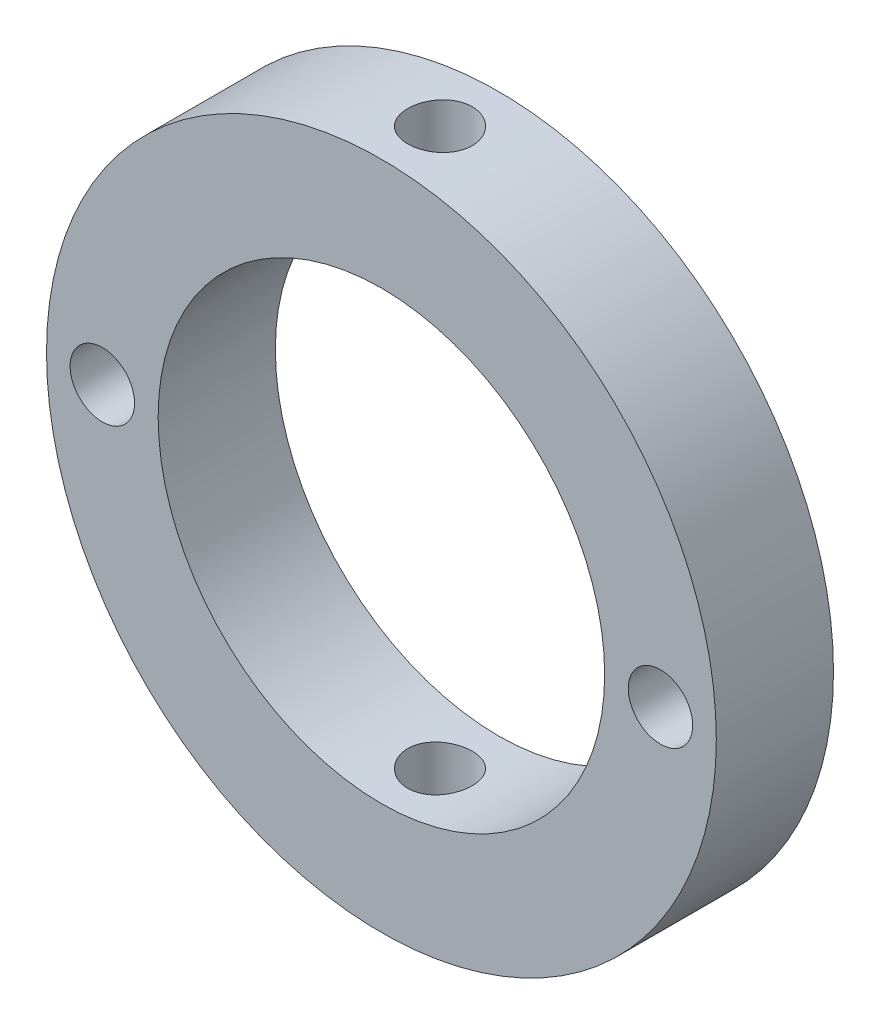
ISO-10303-21;
HEADER;
FILE_DESCRIPTION(('STEP AP214'),'2;1');
FILE_NAME('part.step','',(''),(''),'','','');
FILE_SCHEMA(('AUTOMOTIVE_DESIGN { 1 0 10303 214 1 1 1 1 }'));
ENDSEC;
DATA;
#1=APPLICATION_CONTEXT('core data for automotive mechanical design processes');
#2=APPLICATION_PROTOCOL_DEFINITION('international standard','automotive_design',2000,#1);
#3=PRODUCT_CONTEXT('',#1,'mechanical');
#4=PRODUCT('Part','Part','',(#3));
#5=PRODUCT_RELATED_PRODUCT_CATEGORY('part','',(#4));
#6=PRODUCT_DEFINITION_FORMATION('','',#4);
#7=PRODUCT_DEFINITION_CONTEXT('part definition',#1,'design');
#8=PRODUCT_DEFINITION('design','',#6,#7);
#9=PRODUCT_DEFINITION_SHAPE('','',#8);
#10=(LENGTH_UNIT() NAMED_UNIT(*) SI_UNIT(.MILLI.,.METRE.));
#11=(NAMED_UNIT(*) PLANE_ANGLE_UNIT() SI_UNIT($,.RADIAN.));
#12=(NAMED_UNIT(*) SI_UNIT($,.STERADIAN.) SOLID_ANGLE_UNIT());
#13=UNCERTAINTY_MEASURE_WITH_UNIT(LENGTH_MEASURE(1.E-05),#10,'distance_accuracy_value','');
#14=(GEOMETRIC_REPRESENTATION_CONTEXT(3) GLOBAL_UNCERTAINTY_ASSIGNED_CONTEXT((#13)) GLOBAL_UNIT_ASSIGNED_CONTEXT((#10,
#11,#12)) REPRESENTATION_CONTEXT('',''));
#15=CARTESIAN_POINT('',(0.,0.,0.));
#16=DIRECTION('',(0.,0.,1.));
#17=DIRECTION('',(1.,0.,0.));
#18=AXIS2_PLACEMENT_3D('',#15,#16,#17);
#19=CARTESIAN_POINT('',(0.,0.,10.));
#20=DIRECTION('',(0.,0.,-1.));
#21=DIRECTION('',(-1.,0.,0.));
#22=AXIS2_PLACEMENT_3D('',#19,#20,#21);
#23=CYLINDRICAL_SURFACE('',#22,28.575);
#24=CARTESIAN_POINT('',(0.,-28.575,7.75));
#25=CARTESIAN_POINT('',(0.15408633413521,-28.574998286818,7.74999331284503));
#26=CARTESIAN_POINT('',(0.308275272695408,-28.5737404155956,7.7370058995922));
#27=CARTESIAN_POINT('',(0.612380513382969,-28.5688434695442,7.68539144915056));
#28=CARTESIAN_POINT('',(0.762291883442467,-28.5652017534047,7.64673597094869));
#29=CARTESIAN_POINT('',(1.05339405819005,-28.5559483099833,7.54491931237041));
#30=CARTESIAN_POINT('',(1.19458999182235,-28.5503377545942,7.48177270725815));
#31=CARTESIAN_POINT('',(1.46434716280678,-28.5377744334754,7.33279406523687));
#32=CARTESIAN_POINT('',(1.59291095117358,-28.5308219395893,7.24696662160887));
#33=CARTESIAN_POINT('',(1.83421600823264,-28.5163278672474,7.0547540812368));
#34=CARTESIAN_POINT('',(1.94690910572516,-28.5087845990757,6.94830863183297));
#35=CARTESIAN_POINT('',(2.15285996802942,-28.4939731725445,6.71801016799752));
#36=CARTESIAN_POINT('',(2.24611684506909,-28.486705026764,6.5941563588512));
#37=CARTESIAN_POINT('',(2.41071702631927,-28.4732493133038,6.33225755266607));
#38=CARTESIAN_POINT('',(2.48201701253419,-28.4670638919335,6.19418521107477));
#39=CARTESIAN_POINT('',(2.60040284862985,-28.4564945736404,5.90795854112376));
#40=CARTESIAN_POINT('',(2.64748925535157,-28.4521106352893,5.75980444470342));
#41=CARTESIAN_POINT('',(2.71596917743828,-28.4456556967311,5.45810929325735));
#42=CARTESIAN_POINT('',(2.73744229084303,-28.4435775323188,5.30458646153969));
#43=CARTESIAN_POINT('',(2.75433209997179,-28.4419471122346,4.99610281402987));
#44=CARTESIAN_POINT('',(2.74974943316524,-28.4423947947665,4.84114203351054));
#45=CARTESIAN_POINT('',(2.71472341517206,-28.4457589505183,4.53472917290334));
#46=CARTESIAN_POINT('',(2.68436687627124,-28.448667136087,4.38326706554845));
#47=CARTESIAN_POINT('',(2.59878985306734,-28.4566116613,4.08759756658277));
#48=CARTESIAN_POINT('',(2.54356905524176,-28.4616480277792,3.94339026647598));
#49=CARTESIAN_POINT('',(2.40973487419058,-28.4732909826375,3.66604907765128));
#50=CARTESIAN_POINT('',(2.33108287081272,-28.4799001597327,3.53293393862267));
#51=CARTESIAN_POINT('',(2.15264669245687,-28.4939418137803,3.28176086351381));
#52=CARTESIAN_POINT('',(2.05286194491731,-28.501374313037,3.16370333553695));
#53=CARTESIAN_POINT('',(1.83450744104921,-28.5162620745124,2.94549216597915));
#54=CARTESIAN_POINT('',(1.71586269290913,-28.5237173058586,2.8454135480206));
#55=CARTESIAN_POINT('',(1.46341677312037,-28.5377818164711,2.66658220990429));
#56=CARTESIAN_POINT('',(1.3296155863232,-28.544391094892,2.58782951106155));
#57=CARTESIAN_POINT('',(1.05060370984199,-28.5560209534941,2.45388892145268));
#58=CARTESIAN_POINT('',(0.905391237908122,-28.5610412848905,2.39870472038278));
#59=CARTESIAN_POINT('',(0.607702834550024,-28.5689249879145,2.31352199325398));
#60=CARTESIAN_POINT('',(0.455227104384433,-28.571788419271,2.28352276976951));
#61=CARTESIAN_POINT('',(0.147990259057016,-28.5750280207153,2.24965647326407));
#62=CARTESIAN_POINT('',(-0.00675934223699713,-28.5754140466881,2.24568584906823));
#63=CARTESIAN_POINT('',(-0.314721852769641,-28.5736817452956,2.26371765863068));
#64=CARTESIAN_POINT('',(-0.467934781187164,-28.5715634492254,2.28571976782091));
#65=CARTESIAN_POINT('',(-0.76817678903844,-28.5650669048168,2.35498659694213));
#66=CARTESIAN_POINT('',(-0.91521712853052,-28.5606929838923,2.40220294951204));
#67=CARTESIAN_POINT('',(-1.19928973886011,-28.550176040433,2.52050833427226));
#68=CARTESIAN_POINT('',(-1.3363218010017,-28.5440329810207,2.59159786410106));
#69=CARTESIAN_POINT('',(-1.59695694657946,-28.5306407027442,2.7558892644773));
#70=CARTESIAN_POINT('',(-1.72051688151142,-28.5233880987292,2.84915930632873));
#71=CARTESIAN_POINT('',(-1.95026388240234,-28.5086017718522,3.05506621461011));
#72=CARTESIAN_POINT('',(-2.05645054486634,-28.5010680424659,3.16770353072122));
#73=CARTESIAN_POINT('',(-2.24879524755102,-28.4865390221707,3.40959886011487));
#74=CARTESIAN_POINT('',(-2.3348854198657,-28.4795456076635,3.53891096754525));
#75=CARTESIAN_POINT('',(-2.4841270963848,-28.4669171305512,3.81021778544091));
#76=CARTESIAN_POINT('',(-2.54727889414086,-28.4612820505633,3.95221233357493));
#77=CARTESIAN_POINT('',(-2.64873707434438,-28.4520197162617,4.24461875537302));
#78=CARTESIAN_POINT('',(-2.68708411875699,-28.4483891773798,4.39501641194535));
#79=CARTESIAN_POINT('',(-2.73797630567544,-28.4435366068201,4.70015244837635));
#80=CARTESIAN_POINT('',(-2.75052212875795,-28.4423145116132,4.85489071363066));
#81=CARTESIAN_POINT('',(-2.74944668639643,-28.4424184405973,5.16364098841139));
#82=CARTESIAN_POINT('',(-2.73593203695626,-28.4437340826577,5.3176533839261));
#83=CARTESIAN_POINT('',(-2.68334252810286,-28.4487431285218,5.6212093262212));
#84=CARTESIAN_POINT('',(-2.64426763720747,-28.4524365352543,5.77075286749713));
#85=CARTESIAN_POINT('',(-2.5416956929953,-28.4617821130079,6.06112713345317));
#86=CARTESIAN_POINT('',(-2.4782014863991,-28.4674340557021,6.20195887150493));
#87=CARTESIAN_POINT('',(-2.32860445249417,-28.4800603290669,6.47098270395318));
#88=CARTESIAN_POINT('',(-2.24250180658266,-28.4870346491274,6.59917489975079));
#89=CARTESIAN_POINT('',(-2.04973137917123,-28.5015539824297,6.8398270847963));
#90=CARTESIAN_POINT('',(-1.94298422908307,-28.5091011275991,6.95222336969624));
#91=CARTESIAN_POINT('',(-1.71210967046265,-28.5238962385938,7.15755625763945));
#92=CARTESIAN_POINT('',(-1.58797809511805,-28.5311441321516,7.2504881819719));
#93=CARTESIAN_POINT('',(-1.32554171695937,-28.5445416047856,7.41442365859577));
#94=CARTESIAN_POINT('',(-1.18720419967782,-28.5506885550545,7.48537501309492));
#95=CARTESIAN_POINT('',(-0.900609677264031,-28.561162521696,7.60294821801689));
#96=CARTESIAN_POINT('',(-0.752364125266504,-28.5654915986524,7.64959762953469));
#97=CARTESIAN_POINT('',(-0.502725536718859,-28.5707485774033,7.70555041673348));
#98=CARTESIAN_POINT('',(-0.402930738337124,-28.5723354693155,7.72219638620156));
#99=CARTESIAN_POINT('',(-0.20210533995624,-28.5744617405402,7.7444233503417));
#100=CARTESIAN_POINT('',(-0.10107474459396,-28.5750011237819,7.75000438651802));
#101=CARTESIAN_POINT('',(0.,-28.575,7.75));
#102=B_SPLINE_CURVE_WITH_KNOTS('',3,(#24,#25,#26,#27,#28,#29,#30,#31,#32,#33,#34,#35,#36,#37,
#38,#39,#40,#41,#42,#43,#44,#45,#46,#47,#48,#49,#50,#51,#52,#53,#54,#55,#56,#57,#58,#59,#60,#61,
#62,#63,#64,#65,#66,#67,#68,#69,#70,#71,#72,#73,#74,#75,#76,#77,#78,#79,#80,#81,#82,#83,#84,#85,
#86,#87,#88,#89,#90,#91,#92,#93,#94,#95,#96,#97,#98,#99,#100,#101),.UNSPECIFIED.,.T.,.F.,(4,2,2,
2,2,2,2,2,2,2,2,2,2,2,2,2,2,2,2,2,2,2,2,2,2,2,2,2,2,2,2,2,2,2,2,2,2,2,4),(0.,0.4618899283763,
0.92429250105026,1.38642030794361,1.84845459720451,2.31186236143319,2.77529128771594,
3.23962872475748,3.7039554829284,4.16683546886963,4.62970413023846,5.09101990108819,
5.55234148899928,6.01442769061732,6.47652641340435,6.94051075695629,7.40449556425368,
7.86855298271328,8.33259755001227,8.7947948540551,9.25698638231413,9.7182944772611,
10.1796121888129,10.642366503963,11.105131565076,11.5694375245025,12.0337375418092,
12.4972744989244,12.9607992288479,13.4224316552735,13.8840646502858,14.3456438460017,
14.8072193383823,15.2706059783947,15.7341038766319,16.198694163586,16.6627564002992,
16.965739672111,17.2687218074391),.UNSPECIFIED.);
#103=CARTESIAN_POINT('',(0.,-28.575,7.75));
#104=VERTEX_POINT('',#103);
#105=EDGE_CURVE('E96',#104,#104,#102,.T.);
#106=ORIENTED_EDGE('',*,*,#105,.T.);
#107=EDGE_LOOP('',(#106));
#108=FACE_BOUND('',#107,.T.);
#109=CARTESIAN_POINT('',(0.,28.575,7.75));
#110=CARTESIAN_POINT('',(-0.154086334135209,28.5749982868181,7.74999331284503));
#111=CARTESIAN_POINT('',(-0.308275272695408,28.5737404155956,7.7370058995922));
#112=CARTESIAN_POINT('',(-0.612380513382969,28.5688434695442,7.68539144915056));
#113=CARTESIAN_POINT('',(-0.762291883442466,28.5652017534047,7.64673597094869));
#114=CARTESIAN_POINT('',(-1.05339405819005,28.5559483099833,7.54491931237041));
#115=CARTESIAN_POINT('',(-1.19458999182235,28.5503377545942,7.48177270725815));
#116=CARTESIAN_POINT('',(-1.46434716280678,28.5377744334754,7.33279406523687));
#117=CARTESIAN_POINT('',(-1.59291095117358,28.5308219395893,7.24696662160887));
#118=CARTESIAN_POINT('',(-1.83421600823264,28.5163278672474,7.0547540812368));
#119=CARTESIAN_POINT('',(-1.94690910572516,28.5087845990757,6.94830863183297));
#120=CARTESIAN_POINT('',(-2.15285996802942,28.4939731725445,6.71801016799752));
#121=CARTESIAN_POINT('',(-2.24611684506909,28.486705026764,6.5941563588512));
#122=CARTESIAN_POINT('',(-2.41071702631927,28.4732493133038,6.33225755266607));
#123=CARTESIAN_POINT('',(-2.48201701253419,28.4670638919335,6.19418521107477));
#124=CARTESIAN_POINT('',(-2.60040284862984,28.4564945736404,5.90795854112376));
#125=CARTESIAN_POINT('',(-2.64748925535157,28.4521106352893,5.75980444470342));
#126=CARTESIAN_POINT('',(-2.71596917743828,28.4456556967311,5.45810929325735));
#127=CARTESIAN_POINT('',(-2.73744229084303,28.4435775323188,5.30458646153969));
#128=CARTESIAN_POINT('',(-2.75433209997179,28.4419471122346,4.99610281402987));
#129=CARTESIAN_POINT('',(-2.74974943316524,28.4423947947665,4.84114203351054));
#130=CARTESIAN_POINT('',(-2.71472341517206,28.4457589505183,4.53472917290334));
#131=CARTESIAN_POINT('',(-2.68436687627124,28.448667136087,4.38326706554845));
#132=CARTESIAN_POINT('',(-2.59878985306734,28.4566116613,4.08759756658277));
#133=CARTESIAN_POINT('',(-2.54356905524176,28.4616480277792,3.94339026647598));
#134=CARTESIAN_POINT('',(-2.40973487419059,28.4732909826375,3.66604907765128));
#135=CARTESIAN_POINT('',(-2.33108287081272,28.4799001597327,3.53293393862267));
#136=CARTESIAN_POINT('',(-2.15264669245687,28.4939418137803,3.28176086351381));
#137=CARTESIAN_POINT('',(-2.05286194491731,28.501374313037,3.16370333553695));
#138=CARTESIAN_POINT('',(-1.83450744104921,28.5162620745124,2.94549216597915));
#139=CARTESIAN_POINT('',(-1.71586269290913,28.5237173058586,2.8454135480206));
#140=CARTESIAN_POINT('',(-1.46341677312037,28.5377818164711,2.66658220990429));
#141=CARTESIAN_POINT('',(-1.3296155863232,28.544391094892,2.58782951106155));
#142=CARTESIAN_POINT('',(-1.05060370984199,28.5560209534941,2.45388892145268));
#143=CARTESIAN_POINT('',(-0.905391237908122,28.5610412848905,2.39870472038278));
#144=CARTESIAN_POINT('',(-0.607702834550024,28.5689249879145,2.31352199325398));
#145=CARTESIAN_POINT('',(-0.455227104384433,28.571788419271,2.28352276976951));
#146=CARTESIAN_POINT('',(-0.147990259057016,28.5750280207153,2.24965647326407));
#147=CARTESIAN_POINT('',(0.00675934223699686,28.5754140466881,2.24568584906823));
#148=CARTESIAN_POINT('',(0.314721852769641,28.5736817452956,2.26371765863068));
#149=CARTESIAN_POINT('',(0.467934781187164,28.5715634492254,2.28571976782091));
#150=CARTESIAN_POINT('',(0.76817678903844,28.5650669048168,2.35498659694213));
#151=CARTESIAN_POINT('',(0.91521712853052,28.5606929838923,2.40220294951204));
#152=CARTESIAN_POINT('',(1.19928973886011,28.550176040433,2.52050833427226));
#153=CARTESIAN_POINT('',(1.3363218010017,28.5440329810207,2.59159786410106));
#154=CARTESIAN_POINT('',(1.59695694657946,28.5306407027442,2.7558892644773));
#155=CARTESIAN_POINT('',(1.72051688151142,28.5233880987292,2.84915930632873));
#156=CARTESIAN_POINT('',(1.95026388240234,28.5086017718522,3.05506621461011));
#157=CARTESIAN_POINT('',(2.05645054486634,28.5010680424659,3.16770353072122));
#158=CARTESIAN_POINT('',(2.24879524755102,28.4865390221707,3.40959886011487));
#159=CARTESIAN_POINT('',(2.3348854198657,28.4795456076635,3.53891096754525));
#160=CARTESIAN_POINT('',(2.4841270963848,28.4669171305512,3.81021778544091));
#161=CARTESIAN_POINT('',(2.54727889414086,28.4612820505633,3.95221233357493));
#162=CARTESIAN_POINT('',(2.64873707434438,28.4520197162617,4.24461875537302));
#163=CARTESIAN_POINT('',(2.68708411875699,28.4483891773798,4.39501641194535));
#164=CARTESIAN_POINT('',(2.73797630567544,28.4435366068201,4.70015244837635));
#165=CARTESIAN_POINT('',(2.75052212875795,28.4423145116132,4.85489071363066));
#166=CARTESIAN_POINT('',(2.74944668639643,28.4424184405973,5.16364098841139));
#167=CARTESIAN_POINT('',(2.73593203695626,28.4437340826577,5.3176533839261));
#168=CARTESIAN_POINT('',(2.68334252810286,28.4487431285218,5.6212093262212));
#169=CARTESIAN_POINT('',(2.64426763720747,28.4524365352543,5.77075286749713));
#170=CARTESIAN_POINT('',(2.5416956929953,28.4617821130079,6.06112713345317));
#171=CARTESIAN_POINT('',(2.4782014863991,28.4674340557021,6.20195887150493));
#172=CARTESIAN_POINT('',(2.32860445249417,28.4800603290669,6.47098270395318));
#173=CARTESIAN_POINT('',(2.24250180658266,28.4870346491274,6.59917489975079));
#174=CARTESIAN_POINT('',(2.04973137917123,28.5015539824297,6.8398270847963));
#175=CARTESIAN_POINT('',(1.94298422908307,28.5091011275991,6.95222336969624));
#176=CARTESIAN_POINT('',(1.71210967046265,28.5238962385938,7.15755625763945));
#177=CARTESIAN_POINT('',(1.58797809511805,28.5311441321516,7.2504881819719));
#178=CARTESIAN_POINT('',(1.32554171695937,28.5445416047856,7.41442365859577));
#179=CARTESIAN_POINT('',(1.18720419967782,28.5506885550545,7.48537501309492));
#180=CARTESIAN_POINT('',(0.900609677264031,28.561162521696,7.60294821801689));
#181=CARTESIAN_POINT('',(0.752364125266504,28.5654915986524,7.64959762953469));
#182=CARTESIAN_POINT('',(0.502725536718859,28.5707485774033,7.70555041673348));
#183=CARTESIAN_POINT('',(0.402930738337124,28.5723354693155,7.72219638620156));
#184=CARTESIAN_POINT('',(0.20210533995624,28.5744617405402,7.7444233503417));
#185=CARTESIAN_POINT('',(0.10107474459396,28.5750011237819,7.75000438651802));
#186=CARTESIAN_POINT('',(0.,28.575,7.75));
#187=B_SPLINE_CURVE_WITH_KNOTS('',3,(#109,#110,#111,#112,#113,#114,#115,#116,#117,#118,#119,
#120,#121,#122,#123,#124,#125,#126,#127,#128,#129,#130,#131,#132,#133,#134,#135,#136,#137,#138,
#139,#140,#141,#142,#143,#144,#145,#146,#147,#148,#149,#150,#151,#152,#153,#154,#155,#156,#157,
#158,#159,#160,#161,#162,#163,#164,#165,#166,#167,#168,#169,#170,#171,#172,#173,#174,#175,#176,
#177,#178,#179,#180,#181,#182,#183,#184,#185,#186),.UNSPECIFIED.,.T.,.F.,(4,2,2,2,2,2,2,2,2,2,2,
2,2,2,2,2,2,2,2,2,2,2,2,2,2,2,2,2,2,2,2,2,2,2,2,2,2,2,4),(0.,0.461889928376299,0.92429250105026,
1.38642030794361,1.84845459720451,2.31186236143319,2.77529128771594,3.23962872475748,
3.7039554829284,4.16683546886963,4.62970413023846,5.09101990108819,5.55234148899927,
6.01442769061732,6.47652641340435,6.94051075695629,7.40449556425368,7.86855298271328,
8.33259755001227,8.7947948540551,9.25698638231413,9.7182944772611,10.1796121888129,
10.642366503963,11.105131565076,11.5694375245025,12.0337375418092,12.4972744989244,
12.9607992288479,13.4224316552735,13.8840646502858,14.3456438460017,14.8072193383823,
15.2706059783947,15.7341038766319,16.198694163586,16.6627564002992,16.965739672111,
17.2687218074391),.UNSPECIFIED.);
#188=CARTESIAN_POINT('',(0.,28.575,7.75));
#189=VERTEX_POINT('',#188);
#190=EDGE_CURVE('E89',#189,#189,#187,.T.);
#191=ORIENTED_EDGE('',*,*,#190,.T.);
#192=EDGE_LOOP('',(#191));
#193=FACE_BOUND('',#192,.T.);
#194=CARTESIAN_POINT('',(0.,0.,10.));
#195=DIRECTION('',(0.,0.,1.));
#196=DIRECTION('',(1.,0.,0.));
#197=AXIS2_PLACEMENT_3D('',#194,#195,#196);
#198=CIRCLE('',#197,28.575);
#199=CARTESIAN_POINT('',(28.575,0.,10.));
#200=VERTEX_POINT('',#199);
#201=EDGE_CURVE('E10',#200,#200,#198,.T.);
#202=ORIENTED_EDGE('',*,*,#201,.F.);
#203=EDGE_LOOP('',(#202));
#204=FACE_BOUND('',#203,.T.);
#205=CARTESIAN_POINT('',(0.,0.,0.));
#206=DIRECTION('',(0.,0.,1.));
#207=DIRECTION('',(1.,0.,0.));
#208=AXIS2_PLACEMENT_3D('',#205,#206,#207);
#209=CIRCLE('',#208,28.575);
#210=CARTESIAN_POINT('',(28.575,0.,0.));
#211=VERTEX_POINT('',#210);
#212=EDGE_CURVE('E55',#211,#211,#209,.T.);
#213=ORIENTED_EDGE('',*,*,#212,.T.);
#214=EDGE_LOOP('',(#213));
#215=FACE_BOUND('',#214,.T.);
#216=ADVANCED_FACE('F41',(#108,#193,#204,#215),#23,.T.);
#217=CARTESIAN_POINT('',(0.,0.,10.));
#218=DIRECTION('',(0.,0.,1.));
#219=DIRECTION('',(1.,0.,0.));
#220=AXIS2_PLACEMENT_3D('',#217,#218,#219);
#221=PLANE('',#220);
#222=CARTESIAN_POINT('',(-23.8125,0.,10.));
#223=DIRECTION('',(0.,0.,1.));
#224=DIRECTION('',(1.,0.,0.));
#225=AXIS2_PLACEMENT_3D('',#222,#223,#224);
#226=CIRCLE('',#225,2.75);
#227=CARTESIAN_POINT('',(-21.0625,0.,10.));
#228=VERTEX_POINT('',#227);
#229=EDGE_CURVE('E126',#228,#228,#226,.T.);
#230=ORIENTED_EDGE('',*,*,#229,.F.);
#231=EDGE_LOOP('',(#230));
#232=FACE_BOUND('',#231,.T.);
#233=CARTESIAN_POINT('',(23.8125,0.,10.));
#234=DIRECTION('',(0.,0.,1.));
#235=DIRECTION('',(1.,0.,0.));
#236=AXIS2_PLACEMENT_3D('',#233,#234,#235);
#237=CIRCLE('',#236,2.75);
#238=CARTESIAN_POINT('',(26.5625,0.,10.));
#239=VERTEX_POINT('',#238);
#240=EDGE_CURVE('E129',#239,#239,#237,.T.);
#241=ORIENTED_EDGE('',*,*,#240,.F.);
#242=EDGE_LOOP('',(#241));
#243=FACE_BOUND('',#242,.T.);
#244=CARTESIAN_POINT('',(0.,0.,10.));
#245=DIRECTION('',(0.,0.,1.));
#246=DIRECTION('',(1.,0.,0.));
#247=AXIS2_PLACEMENT_3D('',#244,#245,#246);
#248=CIRCLE('',#247,19.05);
#249=CARTESIAN_POINT('',(19.05,0.,10.));
#250=VERTEX_POINT('',#249);
#251=EDGE_CURVE('E64',#250,#250,#248,.T.);
#252=ORIENTED_EDGE('',*,*,#251,.F.);
#253=EDGE_LOOP('',(#252));
#254=FACE_BOUND('',#253,.T.);
#255=ORIENTED_EDGE('',*,*,#201,.T.);
#256=EDGE_LOOP('',(#255));
#257=FACE_BOUND('',#256,.T.);
#258=ADVANCED_FACE('F113',(#232,#243,#254,#257),#221,.T.);
#259=CARTESIAN_POINT('',(0.,0.,0.));
#260=DIRECTION('',(0.,0.,1.));
#261=DIRECTION('',(1.,0.,0.));
#262=AXIS2_PLACEMENT_3D('',#259,#260,#261);
#263=PLANE('',#262);
#264=CARTESIAN_POINT('',(-23.8125,0.,0.));
#265=DIRECTION('',(0.,0.,1.));
#266=DIRECTION('',(1.,0.,0.));
#267=AXIS2_PLACEMENT_3D('',#264,#265,#266);
#268=CIRCLE('',#267,2.75);
#269=CARTESIAN_POINT('',(-21.0625,0.,0.));
#270=VERTEX_POINT('',#269);
#271=EDGE_CURVE('E72',#270,#270,#268,.T.);
#272=ORIENTED_EDGE('',*,*,#271,.T.);
#273=EDGE_LOOP('',(#272));
#274=FACE_BOUND('',#273,.T.);
#275=CARTESIAN_POINT('',(23.8125,0.,0.));
#276=DIRECTION('',(0.,0.,1.));
#277=DIRECTION('',(1.,0.,0.));
#278=AXIS2_PLACEMENT_3D('',#275,#276,#277);
#279=CIRCLE('',#278,2.75);
#280=CARTESIAN_POINT('',(26.5625,0.,0.));
#281=VERTEX_POINT('',#280);
#282=EDGE_CURVE('E97',#281,#281,#279,.T.);
#283=ORIENTED_EDGE('',*,*,#282,.T.);
#284=EDGE_LOOP('',(#283));
#285=FACE_BOUND('',#284,.T.);
#286=CARTESIAN_POINT('',(0.,0.,0.));
#287=DIRECTION('',(0.,0.,1.));
#288=DIRECTION('',(1.,0.,0.));
#289=AXIS2_PLACEMENT_3D('',#286,#287,#288);
#290=CIRCLE('',#289,19.05);
#291=CARTESIAN_POINT('',(19.05,0.,0.));
#292=VERTEX_POINT('',#291);
#293=EDGE_CURVE('E61',#292,#292,#290,.T.);
#294=ORIENTED_EDGE('',*,*,#293,.T.);
#295=EDGE_LOOP('',(#294));
#296=FACE_BOUND('',#295,.T.);
#297=ORIENTED_EDGE('',*,*,#212,.F.);
#298=EDGE_LOOP('',(#297));
#299=FACE_BOUND('',#298,.T.);
#300=ADVANCED_FACE('F115',(#274,#285,#296,#299),#263,.F.);
#301=CARTESIAN_POINT('',(0.,0.,0.));
#302=DIRECTION('',(0.,0.,1.));
#303=DIRECTION('',(1.,0.,0.));
#304=AXIS2_PLACEMENT_3D('',#301,#302,#303);
#305=CYLINDRICAL_SURFACE('',#304,19.05);
#306=CARTESIAN_POINT('',(0.,-19.05,7.75));
#307=CARTESIAN_POINT('',(-0.153612185571079,-19.0499976039883,7.74999361518348));
#308=CARTESIAN_POINT('',(-0.307315164607962,-19.0481224832416,7.73708563114976));
#309=CARTESIAN_POINT('',(-0.610429525398061,-19.040822695204,7.68580518033048));
#310=CARTESIAN_POINT('',(-0.759836502272957,-19.035394511416,7.64740748562453));
#311=CARTESIAN_POINT('',(-1.04992794462399,-19.0215989674423,7.54631494345615));
#312=CARTESIAN_POINT('',(-1.19061874170431,-19.0132337709244,7.4836379787867));
#313=CARTESIAN_POINT('',(-1.45946306902486,-18.9944900018747,7.33580871096179));
#314=CARTESIAN_POINT('',(-1.58761843472817,-18.984111724768,7.25065970498019));
#315=CARTESIAN_POINT('',(-1.82870686281634,-18.9624127851573,7.0596445106177));
#316=CARTESIAN_POINT('',(-1.94153577774284,-18.9510864457729,6.95364750439194));
#317=CARTESIAN_POINT('',(-2.14787030711562,-18.9288126815533,6.72422659259628));
#318=CARTESIAN_POINT('',(-2.241374842163,-18.9178652779128,6.60080171420821));
#319=CARTESIAN_POINT('',(-2.40680779685035,-18.8975336824845,6.33933410322083));
#320=CARTESIAN_POINT('',(-2.47863618374897,-18.888156824436,6.2012274593348));
#321=CARTESIAN_POINT('',(-2.59803874618278,-18.87210498194,5.91475261054241));
#322=CARTESIAN_POINT('',(-2.645614145422,-18.8654298611776,5.7663849237943));
#323=CARTESIAN_POINT('',(-2.71483837620121,-18.8555927740426,5.46469181180689));
#324=CARTESIAN_POINT('',(-2.73666497786558,-18.8524067301218,5.31140797562191));
#325=CARTESIAN_POINT('',(-2.75432260130912,-18.8498353181026,5.0033227118037));
#326=CARTESIAN_POINT('',(-2.75015500713269,-18.8504497476504,4.84852136540752));
#327=CARTESIAN_POINT('',(-2.71608797287933,-18.8553878355432,4.54304700898826));
#328=CARTESIAN_POINT('',(-2.68638599633069,-18.8596830288461,4.39235145127414));
#329=CARTESIAN_POINT('',(-2.60240219123181,-18.8714542392568,4.09810573475819));
#330=CARTESIAN_POINT('',(-2.54811971448829,-18.8789303402455,3.95455576449791));
#331=CARTESIAN_POINT('',(-2.41630876678858,-18.8962526473893,3.67807223801627));
#332=CARTESIAN_POINT('',(-2.33869613447225,-18.906107408543,3.54517936286504));
#333=CARTESIAN_POINT('',(-2.16248801327464,-18.9270703760709,3.29422871971835));
#334=CARTESIAN_POINT('',(-2.0638912475605,-18.9381786586995,3.17617185515314));
#335=CARTESIAN_POINT('',(-1.84742723036713,-18.960523011069,2.95709958656732));
#336=CARTESIAN_POINT('',(-1.72939010011275,-18.9717593121076,2.85625198668874));
#337=CARTESIAN_POINT('',(-1.47797640579211,-18.9929980308003,2.67577306969269));
#338=CARTESIAN_POINT('',(-1.34459978321466,-19.0030004437475,2.59614183350708));
#339=CARTESIAN_POINT('',(-1.06615159924178,-19.020653743518,2.46034951610362));
#340=CARTESIAN_POINT('',(-0.921073927972692,-19.0283033916446,2.40420079251204));
#341=CARTESIAN_POINT('',(-0.623413703011917,-19.0403787232336,2.31711016965178));
#342=CARTESIAN_POINT('',(-0.470831619532121,-19.0448046084167,2.2861666931995));
#343=CARTESIAN_POINT('',(-0.163942715986439,-19.0499071435478,2.25058670636263));
#344=CARTESIAN_POINT('',(-0.00966318148941766,-19.0506166864751,2.24571938963196));
#345=CARTESIAN_POINT('',(0.297509757903391,-19.0482959535009,2.26181810721776));
#346=CARTESIAN_POINT('',(0.450403202329032,-19.0452657845923,2.28278340246539));
#347=CARTESIAN_POINT('',(0.749769118799288,-19.0358264621818,2.34976032421739));
#348=CARTESIAN_POINT('',(0.896267136409011,-19.0294324051059,2.39566007982898));
#349=CARTESIAN_POINT('',(1.17948782529936,-19.0139801829524,2.51108542631535));
#350=CARTESIAN_POINT('',(1.31621006685413,-19.0049219008497,2.58061205501386));
#351=CARTESIAN_POINT('',(1.57701692344148,-18.9850667629128,2.74186310209697));
#352=CARTESIAN_POINT('',(1.70100970409987,-18.9742585508454,2.83373462943851));
#353=CARTESIAN_POINT('',(1.93189926886828,-18.9521434984845,3.03686197607655));
#354=CARTESIAN_POINT('',(2.03879513582865,-18.9408366314826,3.14811883461448));
#355=CARTESIAN_POINT('',(2.23329130067627,-18.9188949899425,3.38788364280532));
#356=CARTESIAN_POINT('',(2.32073728364832,-18.9082660367088,3.51651738498857));
#357=CARTESIAN_POINT('',(2.4727803746116,-18.8889850337629,3.7867830655526));
#358=CARTESIAN_POINT('',(2.53737806345124,-18.8803329337972,3.92841467338687));
#359=CARTESIAN_POINT('',(2.64164911273441,-18.8660268563795,4.22018645381671));
#360=CARTESIAN_POINT('',(2.68140507284718,-18.8603629529496,4.37029659962483));
#361=CARTESIAN_POINT('',(2.73512784176973,-18.8526476831441,4.6751505284527));
#362=CARTESIAN_POINT('',(2.74909628913179,-18.850596087241,4.82989401643247));
#363=CARTESIAN_POINT('',(2.75081068028365,-18.8503458555568,5.13808469706622));
#364=CARTESIAN_POINT('',(2.73879919815381,-18.8521115774828,5.29153056680609));
#365=CARTESIAN_POINT('',(2.68941303393558,-18.8592197700954,5.59419623272169));
#366=CARTESIAN_POINT('',(2.65203838087788,-18.8645622366881,5.74341603373437));
#367=CARTESIAN_POINT('',(2.55307024872748,-18.878209841947,6.03333497894837));
#368=CARTESIAN_POINT('',(2.49149246931936,-18.8865130597588,6.17403957851153));
#369=CARTESIAN_POINT('',(2.34589004124572,-18.9051491222369,6.44315939111752));
#370=CARTESIAN_POINT('',(2.26186474629126,-18.9154820253378,6.57157425018045));
#371=CARTESIAN_POINT('',(2.07286644603503,-18.9371282644768,6.81370378133673));
#372=CARTESIAN_POINT('',(1.96771345705551,-18.9484495162798,6.92727727125477));
#373=CARTESIAN_POINT('',(1.73982464841536,-18.9707298153439,7.13525410666494));
#374=CARTESIAN_POINT('',(1.61708473548876,-18.9816887775511,7.229652976963));
#375=CARTESIAN_POINT('',(1.35677604447928,-19.0020729155147,7.39702539380015));
#376=CARTESIAN_POINT('',(1.21913510485004,-19.0114900170199,7.4698876662585));
#377=CARTESIAN_POINT('',(0.93350121726318,-19.0276497872082,7.59135298639011));
#378=CARTESIAN_POINT('',(0.785519305405289,-19.034395257341,7.63998145931413));
#379=CARTESIAN_POINT('',(0.530706579460526,-19.0428909736752,7.70041887251595));
#380=CARTESIAN_POINT('',(0.425457468655428,-19.0455433388528,7.71898379591607));
#381=CARTESIAN_POINT('',(0.213486847516465,-19.0490986749688,7.74377651008667));
#382=CARTESIAN_POINT('',(0.106765353521685,-19.0500016653043,7.7500044376505));
#383=CARTESIAN_POINT('',(0.,-19.05,7.75));
#384=B_SPLINE_CURVE_WITH_KNOTS('',3,(#306,#307,#308,#309,#310,#311,#312,#313,#314,#315,#316,
#317,#318,#319,#320,#321,#322,#323,#324,#325,#326,#327,#328,#329,#330,#331,#332,#333,#334,#335,
#336,#337,#338,#339,#340,#341,#342,#343,#344,#345,#346,#347,#348,#349,#350,#351,#352,#353,#354,
#355,#356,#357,#358,#359,#360,#361,#362,#363,#364,#365,#366,#367,#368,#369,#370,#371,#372,#373,
#374,#375,#376,#377,#378,#379,#380,#381,#382,#383),.UNSPECIFIED.,.T.,.F.,(4,2,2,2,2,2,2,2,2,2,2,
2,2,2,2,2,2,2,2,2,2,2,2,2,2,2,2,2,2,2,2,2,2,2,2,2,2,2,4),(0.,0.460446462295983,
0.921349322870438,1.38191335091002,1.84240984097096,2.30589377491872,2.76940359062386,
3.23502083910633,3.70061459216965,4.16297470784859,4.62531020566748,5.08410218733574,
5.54290626815568,6.00338571996739,6.46389319883485,6.92866203397586,7.39343264199682,
7.85844752781115,8.32343331372417,8.7842965153241,9.24514653197317,9.7039457742043,
10.1627651720566,10.6246911339854,11.0866418672415,11.5521364098915,12.0176191179072,
12.4815457255824,12.9454428540995,13.4050272951044,13.8646112100697,14.3238975004149,
14.7831970155485,15.2465891299189,15.710089272136,16.1759439400178,16.6413088151265,
16.961337296182,17.2813622287228),.UNSPECIFIED.);
#385=CARTESIAN_POINT('',(0.,-19.05,7.75));
#386=VERTEX_POINT('',#385);
#387=EDGE_CURVE('E45',#386,#386,#384,.T.);
#388=ORIENTED_EDGE('',*,*,#387,.T.);
#389=EDGE_LOOP('',(#388));
#390=FACE_BOUND('',#389,.T.);
#391=CARTESIAN_POINT('',(0.,19.05,7.75));
#392=CARTESIAN_POINT('',(0.153612185571079,19.0499976039883,7.74999361518348));
#393=CARTESIAN_POINT('',(0.307315164607962,19.0481224832416,7.73708563114976));
#394=CARTESIAN_POINT('',(0.610429525398061,19.040822695204,7.68580518033048));
#395=CARTESIAN_POINT('',(0.759836502272957,19.035394511416,7.64740748562453));
#396=CARTESIAN_POINT('',(1.04992794462399,19.0215989674423,7.54631494345615));
#397=CARTESIAN_POINT('',(1.19061874170431,19.0132337709244,7.4836379787867));
#398=CARTESIAN_POINT('',(1.45946306902486,18.9944900018747,7.33580871096179));
#399=CARTESIAN_POINT('',(1.58761843472817,18.984111724768,7.25065970498019));
#400=CARTESIAN_POINT('',(1.82870686281634,18.9624127851573,7.0596445106177));
#401=CARTESIAN_POINT('',(1.94153577774284,18.9510864457729,6.95364750439194));
#402=CARTESIAN_POINT('',(2.14787030711562,18.9288126815533,6.72422659259628));
#403=CARTESIAN_POINT('',(2.241374842163,18.9178652779128,6.60080171420821));
#404=CARTESIAN_POINT('',(2.40680779685035,18.8975336824845,6.33933410322083));
#405=CARTESIAN_POINT('',(2.47863618374897,18.888156824436,6.2012274593348));
#406=CARTESIAN_POINT('',(2.59803874618278,18.87210498194,5.91475261054241));
#407=CARTESIAN_POINT('',(2.645614145422,18.8654298611776,5.7663849237943));
#408=CARTESIAN_POINT('',(2.71483837620121,18.8555927740426,5.46469181180689));
#409=CARTESIAN_POINT('',(2.73666497786558,18.8524067301218,5.31140797562191));
#410=CARTESIAN_POINT('',(2.75432260130912,18.8498353181026,5.0033227118037));
#411=CARTESIAN_POINT('',(2.75015500713269,18.8504497476504,4.84852136540752));
#412=CARTESIAN_POINT('',(2.71608797287933,18.8553878355432,4.54304700898826));
#413=CARTESIAN_POINT('',(2.68638599633069,18.8596830288461,4.39235145127414));
#414=CARTESIAN_POINT('',(2.60240219123181,18.8714542392568,4.09810573475819));
#415=CARTESIAN_POINT('',(2.54811971448829,18.8789303402455,3.95455576449791));
#416=CARTESIAN_POINT('',(2.41630876678858,18.8962526473893,3.67807223801627));
#417=CARTESIAN_POINT('',(2.33869613447225,18.906107408543,3.54517936286504));
#418=CARTESIAN_POINT('',(2.16248801327464,18.9270703760709,3.29422871971835));
#419=CARTESIAN_POINT('',(2.0638912475605,18.9381786586995,3.17617185515314));
#420=CARTESIAN_POINT('',(1.84742723036713,18.960523011069,2.95709958656732));
#421=CARTESIAN_POINT('',(1.72939010011275,18.9717593121076,2.85625198668874));
#422=CARTESIAN_POINT('',(1.47797640579211,18.9929980308003,2.67577306969269));
#423=CARTESIAN_POINT('',(1.34459978321466,19.0030004437475,2.59614183350708));
#424=CARTESIAN_POINT('',(1.06615159924178,19.020653743518,2.46034951610362));
#425=CARTESIAN_POINT('',(0.921073927972692,19.0283033916446,2.40420079251204));
#426=CARTESIAN_POINT('',(0.623413703011917,19.0403787232336,2.31711016965178));
#427=CARTESIAN_POINT('',(0.470831619532121,19.0448046084167,2.2861666931995));
#428=CARTESIAN_POINT('',(0.163942715986439,19.0499071435478,2.25058670636263));
#429=CARTESIAN_POINT('',(0.00966318148941766,19.0506166864751,2.24571938963196));
#430=CARTESIAN_POINT('',(-0.297509757903391,19.0482959535009,2.26181810721776));
#431=CARTESIAN_POINT('',(-0.450403202329032,19.0452657845923,2.28278340246539));
#432=CARTESIAN_POINT('',(-0.749769118799288,19.0358264621818,2.34976032421739));
#433=CARTESIAN_POINT('',(-0.896267136409011,19.0294324051059,2.39566007982898));
#434=CARTESIAN_POINT('',(-1.17948782529936,19.0139801829524,2.51108542631535));
#435=CARTESIAN_POINT('',(-1.31621006685413,19.0049219008497,2.58061205501386));
#436=CARTESIAN_POINT('',(-1.57701692344148,18.9850667629128,2.74186310209697));
#437=CARTESIAN_POINT('',(-1.70100970409987,18.9742585508454,2.83373462943851));
#438=CARTESIAN_POINT('',(-1.93189926886828,18.9521434984845,3.03686197607655));
#439=CARTESIAN_POINT('',(-2.03879513582865,18.9408366314826,3.14811883461448));
#440=CARTESIAN_POINT('',(-2.23329130067627,18.9188949899425,3.38788364280532));
#441=CARTESIAN_POINT('',(-2.32073728364832,18.9082660367088,3.51651738498857));
#442=CARTESIAN_POINT('',(-2.4727803746116,18.8889850337629,3.7867830655526));
#443=CARTESIAN_POINT('',(-2.53737806345124,18.8803329337972,3.92841467338687));
#444=CARTESIAN_POINT('',(-2.64164911273441,18.8660268563795,4.22018645381671));
#445=CARTESIAN_POINT('',(-2.68140507284718,18.8603629529496,4.37029659962483));
#446=CARTESIAN_POINT('',(-2.73512784176973,18.8526476831441,4.6751505284527));
#447=CARTESIAN_POINT('',(-2.74909628913179,18.850596087241,4.82989401643247));
#448=CARTESIAN_POINT('',(-2.75081068028365,18.8503458555568,5.13808469706622));
#449=CARTESIAN_POINT('',(-2.73879919815381,18.8521115774828,5.29153056680609));
#450=CARTESIAN_POINT('',(-2.68941303393558,18.8592197700954,5.59419623272169));
#451=CARTESIAN_POINT('',(-2.65203838087788,18.8645622366881,5.74341603373437));
#452=CARTESIAN_POINT('',(-2.55307024872748,18.878209841947,6.03333497894837));
#453=CARTESIAN_POINT('',(-2.49149246931936,18.8865130597588,6.17403957851153));
#454=CARTESIAN_POINT('',(-2.34589004124572,18.9051491222369,6.44315939111752));
#455=CARTESIAN_POINT('',(-2.26186474629126,18.9154820253378,6.57157425018045));
#456=CARTESIAN_POINT('',(-2.07286644603503,18.9371282644768,6.81370378133673));
#457=CARTESIAN_POINT('',(-1.96771345705551,18.9484495162798,6.92727727125477));
#458=CARTESIAN_POINT('',(-1.73982464841536,18.9707298153439,7.13525410666494));
#459=CARTESIAN_POINT('',(-1.61708473548876,18.9816887775511,7.229652976963));
#460=CARTESIAN_POINT('',(-1.35677604447928,19.0020729155147,7.39702539380015));
#461=CARTESIAN_POINT('',(-1.21913510485004,19.0114900170199,7.4698876662585));
#462=CARTESIAN_POINT('',(-0.93350121726318,19.0276497872082,7.59135298639011));
#463=CARTESIAN_POINT('',(-0.785519305405289,19.034395257341,7.63998145931413));
#464=CARTESIAN_POINT('',(-0.530706579460526,19.0428909736752,7.70041887251595));
#465=CARTESIAN_POINT('',(-0.425457468655428,19.0455433388528,7.71898379591607));
#466=CARTESIAN_POINT('',(-0.213486847516465,19.0490986749688,7.74377651008667));
#467=CARTESIAN_POINT('',(-0.106765353521685,19.0500016653043,7.7500044376505));
#468=CARTESIAN_POINT('',(0.,19.05,7.75));
#469=B_SPLINE_CURVE_WITH_KNOTS('',3,(#391,#392,#393,#394,#395,#396,#397,#398,#399,#400,#401,
#402,#403,#404,#405,#406,#407,#408,#409,#410,#411,#412,#413,#414,#415,#416,#417,#418,#419,#420,
#421,#422,#423,#424,#425,#426,#427,#428,#429,#430,#431,#432,#433,#434,#435,#436,#437,#438,#439,
#440,#441,#442,#443,#444,#445,#446,#447,#448,#449,#450,#451,#452,#453,#454,#455,#456,#457,#458,
#459,#460,#461,#462,#463,#464,#465,#466,#467,#468),.UNSPECIFIED.,.T.,.F.,(4,2,2,2,2,2,2,2,2,2,2,
2,2,2,2,2,2,2,2,2,2,2,2,2,2,2,2,2,2,2,2,2,2,2,2,2,2,2,4),(0.,0.460446462295983,
0.921349322870438,1.38191335091002,1.84240984097096,2.30589377491872,2.76940359062386,
3.23502083910633,3.70061459216965,4.16297470784859,4.62531020566748,5.08410218733574,
5.54290626815568,6.00338571996739,6.46389319883485,6.92866203397586,7.39343264199682,
7.85844752781115,8.32343331372417,8.7842965153241,9.24514653197317,9.7039457742043,
10.1627651720566,10.6246911339854,11.0866418672415,11.5521364098915,12.0176191179072,
12.4815457255824,12.9454428540995,13.4050272951044,13.8646112100697,14.3238975004149,
14.7831970155485,15.2465891299189,15.710089272136,16.1759439400178,16.6413088151265,
16.961337296182,17.2813622287228),.UNSPECIFIED.);
#470=CARTESIAN_POINT('',(0.,19.05,7.75));
#471=VERTEX_POINT('',#470);
#472=EDGE_CURVE('E66',#471,#471,#469,.T.);
#473=ORIENTED_EDGE('',*,*,#472,.T.);
#474=EDGE_LOOP('',(#473));
#475=FACE_BOUND('',#474,.T.);
#476=ORIENTED_EDGE('',*,*,#293,.F.);
#477=EDGE_LOOP('',(#476));
#478=FACE_BOUND('',#477,.T.);
#479=ORIENTED_EDGE('',*,*,#251,.T.);
#480=EDGE_LOOP('',(#479));
#481=FACE_BOUND('',#480,.T.);
#482=ADVANCED_FACE('F73',(#390,#475,#478,#481),#305,.F.);
#483=CARTESIAN_POINT('',(0.,-28.575,5.));
#484=DIRECTION('',(0.,1.,0.));
#485=DIRECTION('',(0.,0.,1.));
#486=AXIS2_PLACEMENT_3D('',#483,#484,#485);
#487=CYLINDRICAL_SURFACE('',#486,2.75);
#488=ORIENTED_EDGE('',*,*,#472,.F.);
#489=EDGE_LOOP('',(#488));
#490=FACE_BOUND('',#489,.T.);
#491=ORIENTED_EDGE('',*,*,#190,.F.);
#492=EDGE_LOOP('',(#491));
#493=FACE_BOUND('',#492,.T.);
#494=ADVANCED_FACE('F81',(#490,#493),#487,.F.);
#495=ORIENTED_EDGE('',*,*,#387,.F.);
#496=EDGE_LOOP('',(#495));
#497=FACE_BOUND('',#496,.T.);
#498=ORIENTED_EDGE('',*,*,#105,.F.);
#499=EDGE_LOOP('',(#498));
#500=FACE_BOUND('',#499,.T.);
#501=ADVANCED_FACE('F76',(#497,#500),#487,.F.);
#502=CARTESIAN_POINT('',(23.8125,0.,0.));
#503=DIRECTION('',(0.,0.,1.));
#504=DIRECTION('',(1.,0.,0.));
#505=AXIS2_PLACEMENT_3D('',#502,#503,#504);
#506=CYLINDRICAL_SURFACE('',#505,2.75);
#507=ORIENTED_EDGE('',*,*,#282,.F.);
#508=EDGE_LOOP('',(#507));
#509=FACE_BOUND('',#508,.T.);
#510=ORIENTED_EDGE('',*,*,#240,.T.);
#511=EDGE_LOOP('',(#510));
#512=FACE_BOUND('',#511,.T.);
#513=ADVANCED_FACE('F80',(#509,#512),#506,.F.);
#514=CARTESIAN_POINT('',(-23.8125,0.,0.));
#515=DIRECTION('',(0.,0.,1.));
#516=DIRECTION('',(1.,0.,0.));
#517=AXIS2_PLACEMENT_3D('',#514,#515,#516);
#518=CYLINDRICAL_SURFACE('',#517,2.75);
#519=ORIENTED_EDGE('',*,*,#271,.F.);
#520=EDGE_LOOP('',(#519));
#521=FACE_BOUND('',#520,.T.);
#522=ORIENTED_EDGE('',*,*,#229,.T.);
#523=EDGE_LOOP('',(#522));
#524=FACE_BOUND('',#523,.T.);
#525=ADVANCED_FACE('F142',(#521,#524),#518,.F.);
#526=CLOSED_SHELL('',(#216,#258,#300,#482,#494,#501,#513,#525));
#527=MANIFOLD_SOLID_BREP('B2',#526);
#528=ADVANCED_BREP_SHAPE_REPRESENTATION('',(#18,#527),#14);
#529=SHAPE_DEFINITION_REPRESENTATION(#9,#528);
ENDSEC;
END-ISO-10303-21;
